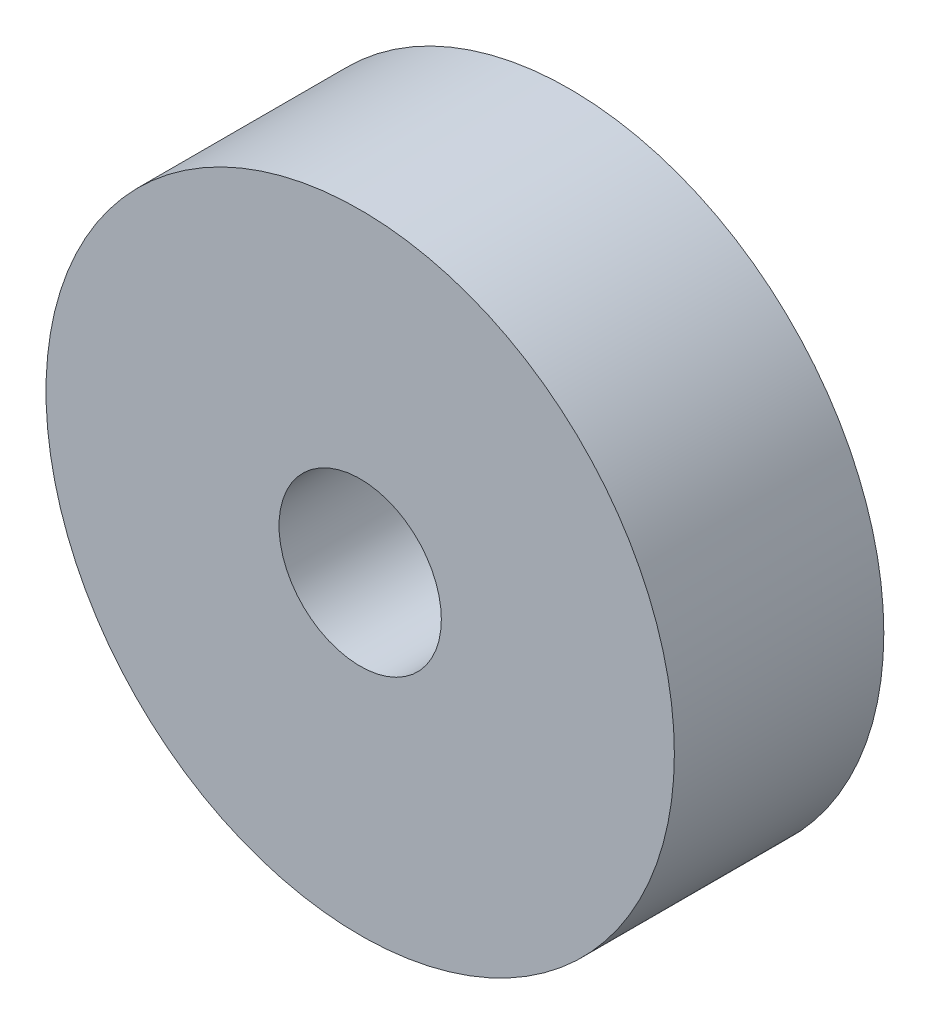
ISO-10303-21;
HEADER;
FILE_DESCRIPTION(('STEP AP214'),'2;1');
FILE_NAME('part.step','',(''),(''),'','','');
FILE_SCHEMA(('AUTOMOTIVE_DESIGN { 1 0 10303 214 1 1 1 1 }'));
ENDSEC;
DATA;
#1=APPLICATION_CONTEXT('core data for automotive mechanical design processes');
#2=APPLICATION_PROTOCOL_DEFINITION('international standard','automotive_design',2000,#1);
#3=PRODUCT_CONTEXT('',#1,'mechanical');
#4=PRODUCT('Part','Part','',(#3));
#5=PRODUCT_RELATED_PRODUCT_CATEGORY('part','',(#4));
#6=PRODUCT_DEFINITION_FORMATION('','',#4);
#7=PRODUCT_DEFINITION_CONTEXT('part definition',#1,'design');
#8=PRODUCT_DEFINITION('design','',#6,#7);
#9=PRODUCT_DEFINITION_SHAPE('','',#8);
#10=(LENGTH_UNIT() NAMED_UNIT(*) SI_UNIT(.MILLI.,.METRE.));
#11=(NAMED_UNIT(*) PLANE_ANGLE_UNIT() SI_UNIT($,.RADIAN.));
#12=(NAMED_UNIT(*) SI_UNIT($,.STERADIAN.) SOLID_ANGLE_UNIT());
#13=UNCERTAINTY_MEASURE_WITH_UNIT(LENGTH_MEASURE(1.E-05),#10,'distance_accuracy_value','');
#14=(GEOMETRIC_REPRESENTATION_CONTEXT(3) GLOBAL_UNCERTAINTY_ASSIGNED_CONTEXT((#13)) GLOBAL_UNIT_ASSIGNED_CONTEXT((#10,
#11,#12)) REPRESENTATION_CONTEXT('',''));
#15=CARTESIAN_POINT('',(0.,0.,0.));
#16=DIRECTION('',(0.,0.,1.));
#17=DIRECTION('',(1.,0.,0.));
#18=AXIS2_PLACEMENT_3D('',#15,#16,#17);
#19=CARTESIAN_POINT('',(0.,0.,4.));
#20=DIRECTION('',(0.,0.,1.));
#21=DIRECTION('',(1.,0.,0.));
#22=AXIS2_PLACEMENT_3D('',#19,#20,#21);
#23=PLANE('',#22);
#24=CARTESIAN_POINT('',(0.,0.,4.));
#25=DIRECTION('',(0.,0.,1.));
#26=DIRECTION('',(1.,0.,0.));
#27=AXIS2_PLACEMENT_3D('',#24,#25,#26);
#28=CIRCLE('',#27,6.);
#29=CARTESIAN_POINT('',(6.,0.,4.));
#30=VERTEX_POINT('',#29);
#31=EDGE_CURVE('E10',#30,#30,#28,.T.);
#32=ORIENTED_EDGE('',*,*,#31,.T.);
#33=EDGE_LOOP('',(#32));
#34=FACE_BOUND('',#33,.T.);
#35=CARTESIAN_POINT('',(0.,0.,4.));
#36=DIRECTION('',(0.,0.,1.));
#37=DIRECTION('',(1.,0.,0.));
#38=AXIS2_PLACEMENT_3D('',#35,#36,#37);
#39=CIRCLE('',#38,1.55);
#40=CARTESIAN_POINT('',(1.55,0.,4.));
#41=VERTEX_POINT('',#40);
#42=EDGE_CURVE('E50',#41,#41,#39,.T.);
#43=ORIENTED_EDGE('',*,*,#42,.F.);
#44=EDGE_LOOP('',(#43));
#45=FACE_BOUND('',#44,.T.);
#46=ADVANCED_FACE('F37',(#34,#45),#23,.T.);
#47=CARTESIAN_POINT('',(0.,0.,0.));
#48=DIRECTION('',(0.,0.,1.));
#49=DIRECTION('',(1.,0.,0.));
#50=AXIS2_PLACEMENT_3D('',#47,#48,#49);
#51=PLANE('',#50);
#52=CARTESIAN_POINT('',(0.,0.,0.));
#53=DIRECTION('',(0.,0.,1.));
#54=DIRECTION('',(1.,0.,0.));
#55=AXIS2_PLACEMENT_3D('',#52,#53,#54);
#56=CIRCLE('',#55,6.);
#57=CARTESIAN_POINT('',(6.,0.,0.));
#58=VERTEX_POINT('',#57);
#59=EDGE_CURVE('E41',#58,#58,#56,.T.);
#60=ORIENTED_EDGE('',*,*,#59,.F.);
#61=EDGE_LOOP('',(#60));
#62=FACE_BOUND('',#61,.T.);
#63=CARTESIAN_POINT('',(0.,0.,0.));
#64=DIRECTION('',(0.,0.,1.));
#65=DIRECTION('',(1.,0.,0.));
#66=AXIS2_PLACEMENT_3D('',#63,#64,#65);
#67=CIRCLE('',#66,1.55);
#68=CARTESIAN_POINT('',(1.55,0.,0.));
#69=VERTEX_POINT('',#68);
#70=EDGE_CURVE('E52',#69,#69,#67,.T.);
#71=ORIENTED_EDGE('',*,*,#70,.T.);
#72=EDGE_LOOP('',(#71));
#73=FACE_BOUND('',#72,.T.);
#74=ADVANCED_FACE('F64',(#62,#73),#51,.F.);
#75=CARTESIAN_POINT('',(0.,0.,4.));
#76=DIRECTION('',(0.,0.,-1.));
#77=DIRECTION('',(-1.,0.,0.));
#78=AXIS2_PLACEMENT_3D('',#75,#76,#77);
#79=CYLINDRICAL_SURFACE('',#78,6.);
#80=ORIENTED_EDGE('',*,*,#31,.F.);
#81=EDGE_LOOP('',(#80));
#82=FACE_BOUND('',#81,.T.);
#83=ORIENTED_EDGE('',*,*,#59,.T.);
#84=EDGE_LOOP('',(#83));
#85=FACE_BOUND('',#84,.T.);
#86=ADVANCED_FACE('F39',(#82,#85),#79,.T.);
#87=CARTESIAN_POINT('',(0.,0.,4.));
#88=DIRECTION('',(0.,0.,-1.));
#89=DIRECTION('',(-1.,0.,0.));
#90=AXIS2_PLACEMENT_3D('',#87,#88,#89);
#91=CYLINDRICAL_SURFACE('',#90,1.55);
#92=ORIENTED_EDGE('',*,*,#42,.T.);
#93=EDGE_LOOP('',(#92));
#94=FACE_BOUND('',#93,.T.);
#95=ORIENTED_EDGE('',*,*,#70,.F.);
#96=EDGE_LOOP('',(#95));
#97=FACE_BOUND('',#96,.T.);
#98=ADVANCED_FACE('F60',(#94,#97),#91,.F.);
#99=CLOSED_SHELL('',(#46,#74,#86,#98));
#100=MANIFOLD_SOLID_BREP('B2',#99);
#101=ADVANCED_BREP_SHAPE_REPRESENTATION('',(#18,#100),#14);
#102=SHAPE_DEFINITION_REPRESENTATION(#9,#101);
ENDSEC;
END-ISO-10303-21;
